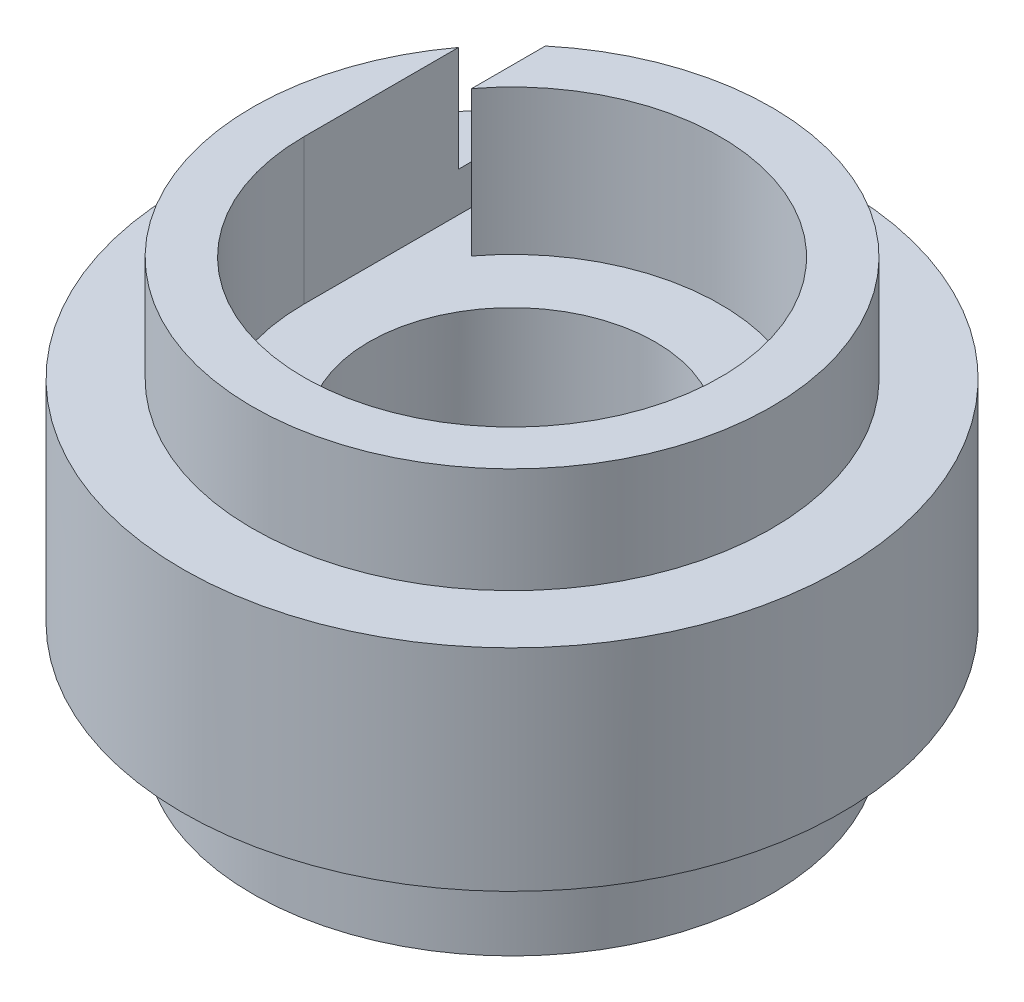
ISO-10303-21;
HEADER;
FILE_DESCRIPTION(('STEP AP214'),'2;1');
FILE_NAME('part.step','',(''),(''),'','','');
FILE_SCHEMA(('AUTOMOTIVE_DESIGN { 1 0 10303 214 1 1 1 1 }'));
ENDSEC;
DATA;
#1=APPLICATION_CONTEXT('core data for automotive mechanical design processes');
#2=APPLICATION_PROTOCOL_DEFINITION('international standard','automotive_design',2000,#1);
#3=PRODUCT_CONTEXT('',#1,'mechanical');
#4=PRODUCT('Part','Part','',(#3));
#5=PRODUCT_RELATED_PRODUCT_CATEGORY('part','',(#4));
#6=PRODUCT_DEFINITION_FORMATION('','',#4);
#7=PRODUCT_DEFINITION_CONTEXT('part definition',#1,'design');
#8=PRODUCT_DEFINITION('design','',#6,#7);
#9=PRODUCT_DEFINITION_SHAPE('','',#8);
#10=(LENGTH_UNIT() NAMED_UNIT(*) SI_UNIT(.MILLI.,.METRE.));
#11=(NAMED_UNIT(*) PLANE_ANGLE_UNIT() SI_UNIT($,.RADIAN.));
#12=(NAMED_UNIT(*) SI_UNIT($,.STERADIAN.) SOLID_ANGLE_UNIT());
#13=UNCERTAINTY_MEASURE_WITH_UNIT(LENGTH_MEASURE(1.E-05),#10,'distance_accuracy_value','');
#14=(GEOMETRIC_REPRESENTATION_CONTEXT(3) GLOBAL_UNCERTAINTY_ASSIGNED_CONTEXT((#13)) GLOBAL_UNIT_ASSIGNED_CONTEXT((#10,
#11,#12)) REPRESENTATION_CONTEXT('',''));
#15=CARTESIAN_POINT('',(0.,0.,0.));
#16=DIRECTION('',(0.,0.,1.));
#17=DIRECTION('',(1.,0.,0.));
#18=AXIS2_PLACEMENT_3D('',#15,#16,#17);
#19=CARTESIAN_POINT('',(0.,20.32,0.));
#20=DIRECTION('',(0.,-1.,0.));
#21=DIRECTION('',(0.,0.,-1.));
#22=AXIS2_PLACEMENT_3D('',#19,#20,#21);
#23=CYLINDRICAL_SURFACE('',#22,31.75);
#24=CARTESIAN_POINT('',(0.,10.16,0.));
#25=DIRECTION('',(0.,1.,0.));
#26=DIRECTION('',(0.,0.,1.));
#27=AXIS2_PLACEMENT_3D('',#24,#25,#26);
#28=CIRCLE('',#27,31.75);
#29=CARTESIAN_POINT('',(-20.066,10.16,-24.6052462698507));
#30=VERTEX_POINT('',#29);
#31=CARTESIAN_POINT('',(-16.002,10.16,-27.4225909789721));
#32=VERTEX_POINT('',#31);
#33=EDGE_CURVE('E173',#30,#32,#28,.T.);
#34=ORIENTED_EDGE('',*,*,#33,.F.);
#35=DIRECTION('',(0.,1.,0.));
#36=VECTOR('',#35,1.);
#37=CARTESIAN_POINT('',(-20.066,6.35,-24.6052462698507));
#38=LINE('',#37,#36);
#39=CARTESIAN_POINT('',(-20.066,6.35,-24.6052462698507));
#40=VERTEX_POINT('',#39);
#41=EDGE_CURVE('E205',#40,#30,#38,.T.);
#42=ORIENTED_EDGE('',*,*,#41,.F.);
#43=CARTESIAN_POINT('',(0.,6.35,0.));
#44=DIRECTION('',(0.,1.,0.));
#45=DIRECTION('',(0.,0.,1.));
#46=AXIS2_PLACEMENT_3D('',#43,#44,#45);
#47=CIRCLE('',#46,31.75);
#48=CARTESIAN_POINT('',(-16.002,6.35,-27.4225909789721));
#49=VERTEX_POINT('',#48);
#50=EDGE_CURVE('E189',#49,#40,#47,.T.);
#51=ORIENTED_EDGE('',*,*,#50,.F.);
#52=DIRECTION('',(0.,1.,0.));
#53=VECTOR('',#52,1.);
#54=CARTESIAN_POINT('',(-16.002,6.35,-27.4225909789721));
#55=LINE('',#54,#53);
#56=EDGE_CURVE('E208',#49,#32,#55,.T.);
#57=ORIENTED_EDGE('',*,*,#56,.T.);
#58=EDGE_LOOP('',(#34,#42,#51,#57));
#59=FACE_BOUND('',#58,.T.);
#60=CARTESIAN_POINT('',(0.,-10.16,0.));
#61=DIRECTION('',(0.,-1.,0.));
#62=DIRECTION('',(0.,0.,1.));
#63=AXIS2_PLACEMENT_3D('',#60,#61,#62);
#64=CIRCLE('',#63,31.75);
#65=CARTESIAN_POINT('',(20.066,-10.16,-24.6052462698507));
#66=VERTEX_POINT('',#65);
#67=CARTESIAN_POINT('',(16.002,-10.16,-27.4225909789721));
#68=VERTEX_POINT('',#67);
#69=EDGE_CURVE('E129',#66,#68,#64,.T.);
#70=ORIENTED_EDGE('',*,*,#69,.F.);
#71=DIRECTION('',(0.,-1.,0.));
#72=VECTOR('',#71,1.);
#73=CARTESIAN_POINT('',(20.066,-6.35,-24.6052462698507));
#74=LINE('',#73,#72);
#75=CARTESIAN_POINT('',(20.066,-6.35,-24.6052462698507));
#76=VERTEX_POINT('',#75);
#77=EDGE_CURVE('E141',#76,#66,#74,.T.);
#78=ORIENTED_EDGE('',*,*,#77,.F.);
#79=CARTESIAN_POINT('',(0.,-6.35,0.));
#80=DIRECTION('',(0.,-1.,0.));
#81=DIRECTION('',(0.,0.,1.));
#82=AXIS2_PLACEMENT_3D('',#79,#80,#81);
#83=CIRCLE('',#82,31.75);
#84=CARTESIAN_POINT('',(16.002,-6.35,-27.4225909789721));
#85=VERTEX_POINT('',#84);
#86=EDGE_CURVE('E154',#85,#76,#83,.T.);
#87=ORIENTED_EDGE('',*,*,#86,.F.);
#88=DIRECTION('',(0.,-1.,0.));
#89=VECTOR('',#88,1.);
#90=CARTESIAN_POINT('',(16.002,-6.35,-27.4225909789721));
#91=LINE('',#90,#89);
#92=EDGE_CURVE('E167',#85,#68,#91,.T.);
#93=ORIENTED_EDGE('',*,*,#92,.T.);
#94=EDGE_LOOP('',(#70,#78,#87,#93));
#95=FACE_BOUND('',#94,.T.);
#96=ADVANCED_FACE('F35',(#59,#95),#23,.T.);
#97=CARTESIAN_POINT('',(0.,-20.32,0.));
#98=DIRECTION('',(0.,1.,0.));
#99=DIRECTION('',(0.,0.,1.));
#100=AXIS2_PLACEMENT_3D('',#97,#98,#99);
#101=PLANE('',#100);
#102=CARTESIAN_POINT('',(0.,-20.32,0.));
#103=DIRECTION('',(0.,-1.,0.));
#104=DIRECTION('',(0.,0.,1.));
#105=AXIS2_PLACEMENT_3D('',#102,#103,#104);
#106=CIRCLE('',#105,25.);
#107=CARTESIAN_POINT('',(20.066,-20.32,-14.9115942809614));
#108=VERTEX_POINT('',#107);
#109=CARTESIAN_POINT('',(16.002,-20.32,-19.2077066824751));
#110=VERTEX_POINT('',#109);
#111=EDGE_CURVE('E124',#108,#110,#106,.T.);
#112=ORIENTED_EDGE('',*,*,#111,.T.);
#113=DIRECTION('',(0.,0.,-1.));
#114=VECTOR('',#113,1.);
#115=CARTESIAN_POINT('',(16.002,-20.32,-12.107037292418));
#116=LINE('',#115,#114);
#117=CARTESIAN_POINT('',(16.002,-20.32,-12.107037292418));
#118=VERTEX_POINT('',#117);
#119=EDGE_CURVE('E143',#118,#110,#116,.T.);
#120=ORIENTED_EDGE('',*,*,#119,.F.);
#121=CARTESIAN_POINT('',(0.,-20.32,0.));
#122=DIRECTION('',(0.,-1.,0.));
#123=DIRECTION('',(0.,0.,1.));
#124=AXIS2_PLACEMENT_3D('',#121,#122,#123);
#125=CIRCLE('',#124,20.066);
#126=CARTESIAN_POINT('',(20.066,-20.32,0.));
#127=VERTEX_POINT('',#126);
#128=EDGE_CURVE('E56',#127,#118,#125,.T.);
#129=ORIENTED_EDGE('',*,*,#128,.F.);
#130=DIRECTION('',(0.,0.,1.));
#131=VECTOR('',#130,1.);
#132=CARTESIAN_POINT('',(20.066,-20.32,0.));
#133=LINE('',#132,#131);
#134=EDGE_CURVE('E151',#108,#127,#133,.T.);
#135=ORIENTED_EDGE('',*,*,#134,.F.);
#136=EDGE_LOOP('',(#112,#120,#129,#135));
#137=FACE_BOUND('',#136,.T.);
#138=ADVANCED_FACE('F223',(#137),#101,.F.);
#139=CARTESIAN_POINT('',(20.066,-6.35,0.));
#140=DIRECTION('',(1.,0.,0.));
#141=DIRECTION('',(0.,0.,-1.));
#142=AXIS2_PLACEMENT_3D('',#139,#140,#141);
#143=PLANE('',#142);
#144=DIRECTION('',(0.,0.,-1.));
#145=VECTOR('',#144,1.);
#146=CARTESIAN_POINT('',(20.066,-10.16,0.));
#147=LINE('',#146,#145);
#148=CARTESIAN_POINT('',(20.066,-10.16,-14.9115942809614));
#149=VERTEX_POINT('',#148);
#150=EDGE_CURVE('E128',#149,#66,#147,.T.);
#151=ORIENTED_EDGE('',*,*,#150,.F.);
#152=DIRECTION('',(0.,-1.,0.));
#153=VECTOR('',#152,1.);
#154=CARTESIAN_POINT('',(20.066,-10.16,-14.9115942809614));
#155=LINE('',#154,#153);
#156=EDGE_CURVE('E121',#108,#149,#155,.F.);
#157=ORIENTED_EDGE('',*,*,#156,.F.);
#158=ORIENTED_EDGE('',*,*,#134,.T.);
#159=DIRECTION('',(0.,-1.,0.));
#160=VECTOR('',#159,1.);
#161=CARTESIAN_POINT('',(20.066,-6.35,0.));
#162=LINE('',#161,#160);
#163=CARTESIAN_POINT('',(20.066,-6.35,0.));
#164=VERTEX_POINT('',#163);
#165=EDGE_CURVE('E163',#164,#127,#162,.T.);
#166=ORIENTED_EDGE('',*,*,#165,.F.);
#167=DIRECTION('',(0.,0.,1.));
#168=VECTOR('',#167,1.);
#169=CARTESIAN_POINT('',(20.066,-6.35,0.));
#170=LINE('',#169,#168);
#171=EDGE_CURVE('E156',#76,#164,#170,.T.);
#172=ORIENTED_EDGE('',*,*,#171,.F.);
#173=ORIENTED_EDGE('',*,*,#77,.T.);
#174=EDGE_LOOP('',(#151,#157,#158,#166,#172,#173));
#175=FACE_BOUND('',#174,.T.);
#176=ADVANCED_FACE('F138',(#175),#143,.F.);
#177=CARTESIAN_POINT('',(16.002,-6.35,-12.107037292418));
#178=DIRECTION('',(-1.,0.,0.));
#179=DIRECTION('',(0.,0.,1.));
#180=AXIS2_PLACEMENT_3D('',#177,#178,#179);
#181=PLANE('',#180);
#182=DIRECTION('',(0.,0.,1.));
#183=VECTOR('',#182,1.);
#184=CARTESIAN_POINT('',(16.002,-10.16,-12.107037292418));
#185=LINE('',#184,#183);
#186=CARTESIAN_POINT('',(16.002,-10.16,-19.2077066824751));
#187=VERTEX_POINT('',#186);
#188=EDGE_CURVE('E11',#68,#187,#185,.T.);
#189=ORIENTED_EDGE('',*,*,#188,.F.);
#190=ORIENTED_EDGE('',*,*,#92,.F.);
#191=DIRECTION('',(0.,0.,-1.));
#192=VECTOR('',#191,1.);
#193=CARTESIAN_POINT('',(16.002,-6.35,-12.107037292418));
#194=LINE('',#193,#192);
#195=CARTESIAN_POINT('',(16.002,-6.35,-12.107037292418));
#196=VERTEX_POINT('',#195);
#197=EDGE_CURVE('E150',#196,#85,#194,.T.);
#198=ORIENTED_EDGE('',*,*,#197,.F.);
#199=DIRECTION('',(0.,-1.,0.));
#200=VECTOR('',#199,1.);
#201=CARTESIAN_POINT('',(16.002,-6.35,-12.107037292418));
#202=LINE('',#201,#200);
#203=EDGE_CURVE('E158',#196,#118,#202,.T.);
#204=ORIENTED_EDGE('',*,*,#203,.T.);
#205=ORIENTED_EDGE('',*,*,#119,.T.);
#206=DIRECTION('',(0.,-1.,0.));
#207=VECTOR('',#206,1.);
#208=CARTESIAN_POINT('',(16.002,-10.16,-19.2077066824751));
#209=LINE('',#208,#207);
#210=EDGE_CURVE('E42',#187,#110,#209,.T.);
#211=ORIENTED_EDGE('',*,*,#210,.F.);
#212=EDGE_LOOP('',(#189,#190,#198,#204,#205,#211));
#213=FACE_BOUND('',#212,.T.);
#214=ADVANCED_FACE('F225',(#213),#181,.F.);
#215=CARTESIAN_POINT('',(0.,20.32,0.));
#216=DIRECTION('',(0.,-1.,0.));
#217=DIRECTION('',(0.,0.,-1.));
#218=AXIS2_PLACEMENT_3D('',#215,#216,#217);
#219=CYLINDRICAL_SURFACE('',#218,13.7885714285714);
#220=CARTESIAN_POINT('',(0.,6.35,0.));
#221=DIRECTION('',(0.,1.,0.));
#222=DIRECTION('',(0.,0.,1.));
#223=AXIS2_PLACEMENT_3D('',#220,#221,#222);
#224=CIRCLE('',#223,13.7885714285714);
#225=CARTESIAN_POINT('',(0.,6.35,13.7885714285714));
#226=VERTEX_POINT('',#225);
#227=EDGE_CURVE('E204',#226,#226,#224,.T.);
#228=ORIENTED_EDGE('',*,*,#227,.T.);
#229=EDGE_LOOP('',(#228));
#230=FACE_BOUND('',#229,.T.);
#231=CARTESIAN_POINT('',(0.,-6.34999999999999,0.));
#232=DIRECTION('',(0.,-1.,0.));
#233=DIRECTION('',(0.,0.,-1.));
#234=AXIS2_PLACEMENT_3D('',#231,#232,#233);
#235=CIRCLE('',#234,13.7885714285714);
#236=CARTESIAN_POINT('',(0.,-6.34999999999999,-13.7885714285714));
#237=VERTEX_POINT('',#236);
#238=EDGE_CURVE('E165',#237,#237,#235,.T.);
#239=ORIENTED_EDGE('',*,*,#238,.T.);
#240=EDGE_LOOP('',(#239));
#241=FACE_BOUND('',#240,.T.);
#242=ADVANCED_FACE('F278',(#230,#241),#219,.F.);
#243=CARTESIAN_POINT('',(0.,20.32,0.));
#244=DIRECTION('',(0.,1.,0.));
#245=DIRECTION('',(0.,0.,1.));
#246=AXIS2_PLACEMENT_3D('',#243,#244,#245);
#247=PLANE('',#246);
#248=DIRECTION('',(0.,0.,1.));
#249=VECTOR('',#248,1.);
#250=CARTESIAN_POINT('',(-20.066,20.32,0.));
#251=LINE('',#250,#249);
#252=CARTESIAN_POINT('',(-20.066,20.32,-14.9115942809614));
#253=VERTEX_POINT('',#252);
#254=CARTESIAN_POINT('',(-20.066,20.32,0.));
#255=VERTEX_POINT('',#254);
#256=EDGE_CURVE('E187',#253,#255,#251,.T.);
#257=ORIENTED_EDGE('',*,*,#256,.F.);
#258=CARTESIAN_POINT('',(0.,20.32,0.));
#259=DIRECTION('',(0.,1.,0.));
#260=DIRECTION('',(0.,0.,1.));
#261=AXIS2_PLACEMENT_3D('',#258,#259,#260);
#262=CIRCLE('',#261,25.);
#263=CARTESIAN_POINT('',(-16.002,20.32,-19.2077066824751));
#264=VERTEX_POINT('',#263);
#265=EDGE_CURVE('E174',#253,#264,#262,.T.);
#266=ORIENTED_EDGE('',*,*,#265,.T.);
#267=DIRECTION('',(0.,0.,-1.));
#268=VECTOR('',#267,1.);
#269=CARTESIAN_POINT('',(-16.002,20.32,-12.107037292418));
#270=LINE('',#269,#268);
#271=CARTESIAN_POINT('',(-16.002,20.32,-12.107037292418));
#272=VERTEX_POINT('',#271);
#273=EDGE_CURVE('E197',#272,#264,#270,.T.);
#274=ORIENTED_EDGE('',*,*,#273,.F.);
#275=CARTESIAN_POINT('',(0.,20.32,0.));
#276=DIRECTION('',(0.,1.,0.));
#277=DIRECTION('',(0.,0.,1.));
#278=AXIS2_PLACEMENT_3D('',#275,#276,#277);
#279=CIRCLE('',#278,20.066);
#280=EDGE_CURVE('E182',#255,#272,#279,.T.);
#281=ORIENTED_EDGE('',*,*,#280,.F.);
#282=EDGE_LOOP('',(#257,#266,#274,#281));
#283=FACE_BOUND('',#282,.T.);
#284=ADVANCED_FACE('F263',(#283),#247,.T.);
#285=CARTESIAN_POINT('',(-20.066,6.35,0.));
#286=DIRECTION('',(-1.,0.,0.));
#287=DIRECTION('',(0.,0.,1.));
#288=AXIS2_PLACEMENT_3D('',#285,#286,#287);
#289=PLANE('',#288);
#290=DIRECTION('',(0.,0.,-1.));
#291=VECTOR('',#290,1.);
#292=CARTESIAN_POINT('',(-20.066,10.16,0.));
#293=LINE('',#292,#291);
#294=CARTESIAN_POINT('',(-20.066,10.16,-14.9115942809614));
#295=VERTEX_POINT('',#294);
#296=EDGE_CURVE('E180',#295,#30,#293,.T.);
#297=ORIENTED_EDGE('',*,*,#296,.F.);
#298=DIRECTION('',(0.,1.,0.));
#299=VECTOR('',#298,1.);
#300=CARTESIAN_POINT('',(-20.066,10.16,-14.9115942809614));
#301=LINE('',#300,#299);
#302=EDGE_CURVE('E178',#253,#295,#301,.F.);
#303=ORIENTED_EDGE('',*,*,#302,.F.);
#304=ORIENTED_EDGE('',*,*,#256,.T.);
#305=DIRECTION('',(0.,1.,0.));
#306=VECTOR('',#305,1.);
#307=CARTESIAN_POINT('',(-20.066,6.35,0.));
#308=LINE('',#307,#306);
#309=CARTESIAN_POINT('',(-20.066,6.35,0.));
#310=VERTEX_POINT('',#309);
#311=EDGE_CURVE('E201',#310,#255,#308,.T.);
#312=ORIENTED_EDGE('',*,*,#311,.F.);
#313=DIRECTION('',(0.,0.,1.));
#314=VECTOR('',#313,1.);
#315=CARTESIAN_POINT('',(-20.066,6.35,0.));
#316=LINE('',#315,#314);
#317=EDGE_CURVE('E191',#40,#310,#316,.T.);
#318=ORIENTED_EDGE('',*,*,#317,.F.);
#319=ORIENTED_EDGE('',*,*,#41,.T.);
#320=EDGE_LOOP('',(#297,#303,#304,#312,#318,#319));
#321=FACE_BOUND('',#320,.T.);
#322=ADVANCED_FACE('F247',(#321),#289,.F.);
#323=CARTESIAN_POINT('',(-16.002,6.35,-12.107037292418));
#324=DIRECTION('',(1.,0.,0.));
#325=DIRECTION('',(0.,0.,-1.));
#326=AXIS2_PLACEMENT_3D('',#323,#324,#325);
#327=PLANE('',#326);
#328=DIRECTION('',(0.,0.,1.));
#329=VECTOR('',#328,1.);
#330=CARTESIAN_POINT('',(-16.002,10.16,-12.107037292418));
#331=LINE('',#330,#329);
#332=CARTESIAN_POINT('',(-16.002,10.16,-19.2077066824751));
#333=VERTEX_POINT('',#332);
#334=EDGE_CURVE('E216',#32,#333,#331,.T.);
#335=ORIENTED_EDGE('',*,*,#334,.F.);
#336=ORIENTED_EDGE('',*,*,#56,.F.);
#337=DIRECTION('',(0.,0.,-1.));
#338=VECTOR('',#337,1.);
#339=CARTESIAN_POINT('',(-16.002,6.35,-12.107037292418));
#340=LINE('',#339,#338);
#341=CARTESIAN_POINT('',(-16.002,6.35,-12.107037292418));
#342=VERTEX_POINT('',#341);
#343=EDGE_CURVE('E186',#342,#49,#340,.T.);
#344=ORIENTED_EDGE('',*,*,#343,.F.);
#345=DIRECTION('',(0.,1.,0.));
#346=VECTOR('',#345,1.);
#347=CARTESIAN_POINT('',(-16.002,6.35,-12.107037292418));
#348=LINE('',#347,#346);
#349=EDGE_CURVE('E194',#342,#272,#348,.T.);
#350=ORIENTED_EDGE('',*,*,#349,.T.);
#351=ORIENTED_EDGE('',*,*,#273,.T.);
#352=DIRECTION('',(0.,1.,0.));
#353=VECTOR('',#352,1.);
#354=CARTESIAN_POINT('',(-16.002,10.16,-19.2077066824751));
#355=LINE('',#354,#353);
#356=EDGE_CURVE('E214',#333,#264,#355,.T.);
#357=ORIENTED_EDGE('',*,*,#356,.F.);
#358=EDGE_LOOP('',(#335,#336,#344,#350,#351,#357));
#359=FACE_BOUND('',#358,.T.);
#360=ADVANCED_FACE('F254',(#359),#327,.F.);
#361=CARTESIAN_POINT('',(0.,6.35,0.));
#362=DIRECTION('',(0.,1.,0.));
#363=DIRECTION('',(0.,0.,1.));
#364=AXIS2_PLACEMENT_3D('',#361,#362,#363);
#365=CYLINDRICAL_SURFACE('',#364,20.066);
#366=ORIENTED_EDGE('',*,*,#280,.T.);
#367=ORIENTED_EDGE('',*,*,#349,.F.);
#368=CARTESIAN_POINT('',(0.,6.35,0.));
#369=DIRECTION('',(0.,1.,0.));
#370=DIRECTION('',(0.,0.,1.));
#371=AXIS2_PLACEMENT_3D('',#368,#369,#370);
#372=CIRCLE('',#371,20.066);
#373=EDGE_CURVE('E183',#310,#342,#372,.T.);
#374=ORIENTED_EDGE('',*,*,#373,.F.);
#375=ORIENTED_EDGE('',*,*,#311,.T.);
#376=EDGE_LOOP('',(#366,#367,#374,#375));
#377=FACE_BOUND('',#376,.T.);
#378=ADVANCED_FACE('F266',(#377),#365,.F.);
#379=CARTESIAN_POINT('',(0.,6.35,0.));
#380=DIRECTION('',(0.,1.,0.));
#381=DIRECTION('',(0.,0.,1.));
#382=AXIS2_PLACEMENT_3D('',#379,#380,#381);
#383=PLANE('',#382);
#384=ORIENTED_EDGE('',*,*,#227,.F.);
#385=EDGE_LOOP('',(#384));
#386=FACE_BOUND('',#385,.T.);
#387=ORIENTED_EDGE('',*,*,#373,.T.);
#388=ORIENTED_EDGE('',*,*,#343,.T.);
#389=ORIENTED_EDGE('',*,*,#50,.T.);
#390=ORIENTED_EDGE('',*,*,#317,.T.);
#391=EDGE_LOOP('',(#387,#388,#389,#390));
#392=FACE_BOUND('',#391,.T.);
#393=ADVANCED_FACE('F251',(#386,#392),#383,.T.);
#394=CARTESIAN_POINT('',(0.,10.16,0.));
#395=DIRECTION('',(0.,1.,0.));
#396=DIRECTION('',(0.,0.,1.));
#397=AXIS2_PLACEMENT_3D('',#394,#395,#396);
#398=PLANE('',#397);
#399=ORIENTED_EDGE('',*,*,#296,.T.);
#400=ORIENTED_EDGE('',*,*,#33,.T.);
#401=ORIENTED_EDGE('',*,*,#334,.T.);
#402=CARTESIAN_POINT('',(0.,10.16,0.));
#403=DIRECTION('',(0.,1.,0.));
#404=DIRECTION('',(0.,0.,1.));
#405=AXIS2_PLACEMENT_3D('',#402,#403,#404);
#406=CIRCLE('',#405,25.);
#407=EDGE_CURVE('E171',#295,#333,#406,.T.);
#408=ORIENTED_EDGE('',*,*,#407,.F.);
#409=EDGE_LOOP('',(#399,#400,#401,#408));
#410=FACE_BOUND('',#409,.T.);
#411=ADVANCED_FACE('F257',(#410),#398,.T.);
#412=CARTESIAN_POINT('',(0.,10.16,0.));
#413=DIRECTION('',(0.,1.,0.));
#414=DIRECTION('',(0.,0.,1.));
#415=AXIS2_PLACEMENT_3D('',#412,#413,#414);
#416=CYLINDRICAL_SURFACE('',#415,25.);
#417=ORIENTED_EDGE('',*,*,#302,.T.);
#418=ORIENTED_EDGE('',*,*,#407,.T.);
#419=ORIENTED_EDGE('',*,*,#356,.T.);
#420=ORIENTED_EDGE('',*,*,#265,.F.);
#421=EDGE_LOOP('',(#417,#418,#419,#420));
#422=FACE_BOUND('',#421,.T.);
#423=ADVANCED_FACE('F259',(#422),#416,.T.);
#424=CARTESIAN_POINT('',(0.,-6.35,0.));
#425=DIRECTION('',(0.,-1.,0.));
#426=DIRECTION('',(0.,0.,-1.));
#427=AXIS2_PLACEMENT_3D('',#424,#425,#426);
#428=CYLINDRICAL_SURFACE('',#427,20.066);
#429=ORIENTED_EDGE('',*,*,#128,.T.);
#430=ORIENTED_EDGE('',*,*,#203,.F.);
#431=CARTESIAN_POINT('',(0.,-6.35,0.));
#432=DIRECTION('',(0.,-1.,0.));
#433=DIRECTION('',(0.,0.,1.));
#434=AXIS2_PLACEMENT_3D('',#431,#432,#433);
#435=CIRCLE('',#434,20.066);
#436=EDGE_CURVE('E147',#164,#196,#435,.T.);
#437=ORIENTED_EDGE('',*,*,#436,.F.);
#438=ORIENTED_EDGE('',*,*,#165,.T.);
#439=EDGE_LOOP('',(#429,#430,#437,#438));
#440=FACE_BOUND('',#439,.T.);
#441=ADVANCED_FACE('F228',(#440),#428,.F.);
#442=CARTESIAN_POINT('',(0.,-6.35,0.));
#443=DIRECTION('',(0.,-1.,0.));
#444=DIRECTION('',(0.,0.,1.));
#445=AXIS2_PLACEMENT_3D('',#442,#443,#444);
#446=PLANE('',#445);
#447=ORIENTED_EDGE('',*,*,#238,.F.);
#448=EDGE_LOOP('',(#447));
#449=FACE_BOUND('',#448,.T.);
#450=ORIENTED_EDGE('',*,*,#436,.T.);
#451=ORIENTED_EDGE('',*,*,#197,.T.);
#452=ORIENTED_EDGE('',*,*,#86,.T.);
#453=ORIENTED_EDGE('',*,*,#171,.T.);
#454=EDGE_LOOP('',(#450,#451,#452,#453));
#455=FACE_BOUND('',#454,.T.);
#456=ADVANCED_FACE('F230',(#449,#455),#446,.T.);
#457=CARTESIAN_POINT('',(0.,-10.16,0.));
#458=DIRECTION('',(0.,-1.,0.));
#459=DIRECTION('',(0.,0.,1.));
#460=AXIS2_PLACEMENT_3D('',#457,#458,#459);
#461=PLANE('',#460);
#462=ORIENTED_EDGE('',*,*,#150,.T.);
#463=ORIENTED_EDGE('',*,*,#69,.T.);
#464=ORIENTED_EDGE('',*,*,#188,.T.);
#465=CARTESIAN_POINT('',(0.,-10.16,0.));
#466=DIRECTION('',(0.,-1.,0.));
#467=DIRECTION('',(0.,0.,1.));
#468=AXIS2_PLACEMENT_3D('',#465,#466,#467);
#469=CIRCLE('',#468,25.);
#470=EDGE_CURVE('E49',#149,#187,#469,.T.);
#471=ORIENTED_EDGE('',*,*,#470,.F.);
#472=EDGE_LOOP('',(#462,#463,#464,#471));
#473=FACE_BOUND('',#472,.T.);
#474=ADVANCED_FACE('F132',(#473),#461,.T.);
#475=CARTESIAN_POINT('',(0.,-10.16,0.));
#476=DIRECTION('',(0.,-1.,0.));
#477=DIRECTION('',(0.,0.,-1.));
#478=AXIS2_PLACEMENT_3D('',#475,#476,#477);
#479=CYLINDRICAL_SURFACE('',#478,25.);
#480=ORIENTED_EDGE('',*,*,#156,.T.);
#481=ORIENTED_EDGE('',*,*,#470,.T.);
#482=ORIENTED_EDGE('',*,*,#210,.T.);
#483=ORIENTED_EDGE('',*,*,#111,.F.);
#484=EDGE_LOOP('',(#480,#481,#482,#483));
#485=FACE_BOUND('',#484,.T.);
#486=ADVANCED_FACE('F122',(#485),#479,.T.);
#487=CLOSED_SHELL('',(#96,#138,#176,#214,#242,#284,#322,#360,#378,#393,#411,#423,#441,#456,#474,#486));
#488=MANIFOLD_SOLID_BREP('B2',#487);
#489=ADVANCED_BREP_SHAPE_REPRESENTATION('',(#18,#488),#14);
#490=SHAPE_DEFINITION_REPRESENTATION(#9,#489);
ENDSEC;
END-ISO-10303-21;
